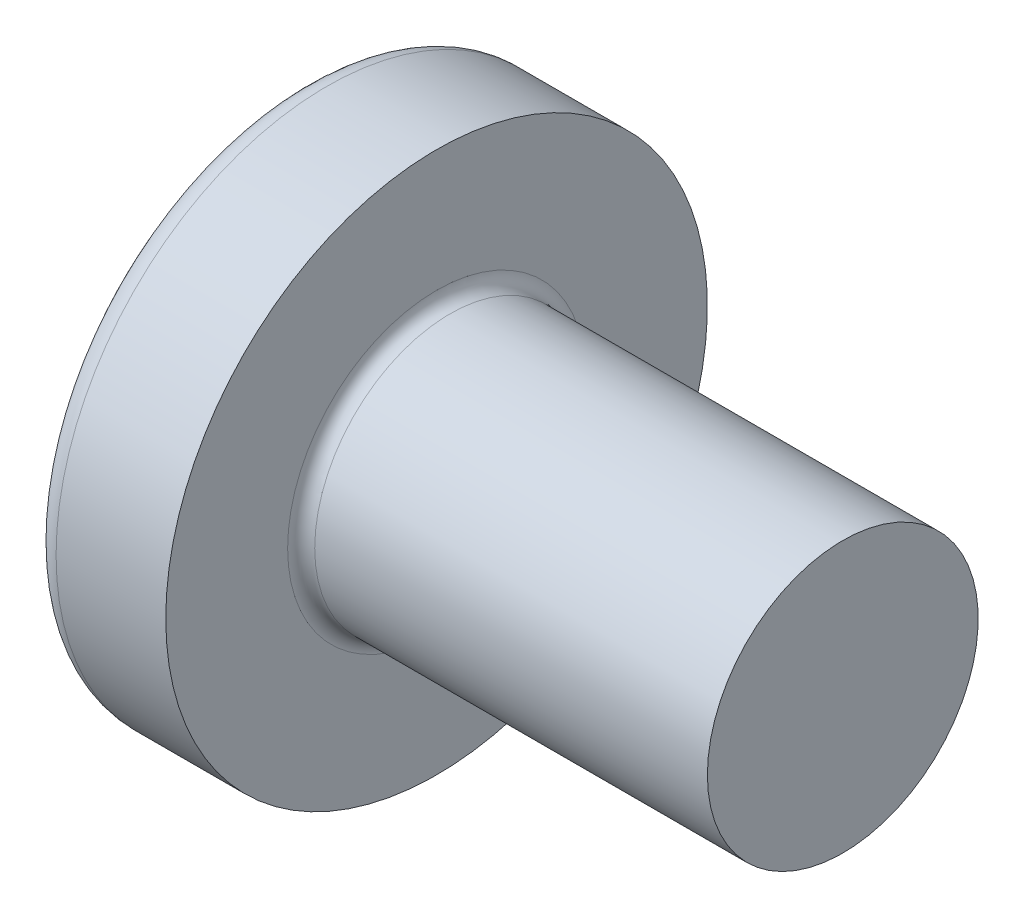
ISO-10303-21;
HEADER;
FILE_DESCRIPTION(('STEP AP214'),'2;1');
FILE_NAME('part.step','',(''),(''),'','','');
FILE_SCHEMA(('AUTOMOTIVE_DESIGN { 1 0 10303 214 1 1 1 1 }'));
ENDSEC;
DATA;
#1=APPLICATION_CONTEXT('core data for automotive mechanical design processes');
#2=APPLICATION_PROTOCOL_DEFINITION('international standard','automotive_design',2000,#1);
#3=PRODUCT_CONTEXT('',#1,'mechanical');
#4=PRODUCT('Part','Part','',(#3));
#5=PRODUCT_RELATED_PRODUCT_CATEGORY('part','',(#4));
#6=PRODUCT_DEFINITION_FORMATION('','',#4);
#7=PRODUCT_DEFINITION_CONTEXT('part definition',#1,'design');
#8=PRODUCT_DEFINITION('design','',#6,#7);
#9=PRODUCT_DEFINITION_SHAPE('','',#8);
#10=(LENGTH_UNIT() NAMED_UNIT(*) SI_UNIT(.MILLI.,.METRE.));
#11=(NAMED_UNIT(*) PLANE_ANGLE_UNIT() SI_UNIT($,.RADIAN.));
#12=(NAMED_UNIT(*) SI_UNIT($,.STERADIAN.) SOLID_ANGLE_UNIT());
#13=UNCERTAINTY_MEASURE_WITH_UNIT(LENGTH_MEASURE(1.E-05),#10,'distance_accuracy_value','');
#14=(GEOMETRIC_REPRESENTATION_CONTEXT(3) GLOBAL_UNCERTAINTY_ASSIGNED_CONTEXT((#13)) GLOBAL_UNIT_ASSIGNED_CONTEXT((#10,
#11,#12)) REPRESENTATION_CONTEXT('',''));
#15=CARTESIAN_POINT('',(0.,0.,0.));
#16=DIRECTION('',(0.,0.,1.));
#17=DIRECTION('',(1.,0.,0.));
#18=AXIS2_PLACEMENT_3D('',#15,#16,#17);
#19=CARTESIAN_POINT('',(3.2,0.,0.));
#20=DIRECTION('',(-1.,0.,0.));
#21=DIRECTION('',(0.,1.,0.));
#22=AXIS2_PLACEMENT_3D('',#19,#20,#21);
#23=SPHERICAL_SURFACE('',#22,3.2);
#24=CARTESIAN_POINT('',(0.646379599446117,0.,0.));
#25=DIRECTION('',(-1.,0.,0.));
#26=DIRECTION('',(0.,0.,1.));
#27=AXIS2_PLACEMENT_3D('',#24,#25,#26);
#28=CIRCLE('',#27,1.92847682119205);
#29=CARTESIAN_POINT('',(0.646379599446117,0.,1.92847682119205));
#30=VERTEX_POINT('',#29);
#31=EDGE_CURVE('E236',#30,#30,#28,.T.);
#32=ORIENTED_EDGE('',*,*,#31,.T.);
#33=EDGE_LOOP('',(#32));
#34=FACE_BOUND('',#33,.T.);
#35=CARTESIAN_POINT('',(0.0321614467928854,0.,0.));
#36=DIRECTION('',(1.,0.,0.));
#37=DIRECTION('',(0.,0.,-1.));
#38=AXIS2_PLACEMENT_3D('',#35,#36,#37);
#39=CIRCLE('',#38,0.452547125518057);
#40=CARTESIAN_POINT('',(0.0321614467928853,-0.239999999999998,-0.38366508938742));
#41=VERTEX_POINT('',#40);
#42=CARTESIAN_POINT('',(0.0321614467928852,-0.383665089387424,-0.24));
#43=VERTEX_POINT('',#42);
#44=EDGE_CURVE('E372',#41,#43,#39,.F.);
#45=ORIENTED_EDGE('',*,*,#44,.F.);
#46=CARTESIAN_POINT('',(3.2,-0.24,0.));
#47=DIRECTION('',(0.,1.,0.));
#48=DIRECTION('',(0.,0.,1.));
#49=AXIS2_PLACEMENT_3D('',#46,#47,#48);
#50=CIRCLE('',#49,3.19098730802866);
#51=CARTESIAN_POINT('',(0.160076673366102,-0.239999999999996,-0.970188728128246));
#52=VERTEX_POINT('',#51);
#53=EDGE_CURVE('E298',#52,#41,#50,.T.);
#54=ORIENTED_EDGE('',*,*,#53,.F.);
#55=CARTESIAN_POINT('',(2.98218780828175,0.,0.436863744320002));
#56=DIRECTION('',(0.446197753347436,0.,-0.894934391398443));
#57=DIRECTION('',(-0.894934391398442,0.,-0.446197753347436));
#58=AXIS2_PLACEMENT_3D('',#55,#56,#57);
#59=CIRCLE('',#58,3.16254769419176);
#60=CARTESIAN_POINT('',(0.160076673366103,0.240000000000003,-0.970188728128243));
#61=VERTEX_POINT('',#60);
#62=EDGE_CURVE('E270',#52,#61,#59,.T.);
#63=ORIENTED_EDGE('',*,*,#62,.T.);
#64=CARTESIAN_POINT('',(3.2,0.24,0.));
#65=DIRECTION('',(0.,-1.,0.));
#66=DIRECTION('',(0.,0.,-1.));
#67=AXIS2_PLACEMENT_3D('',#64,#65,#66);
#68=CIRCLE('',#67,3.19098730802866);
#69=CARTESIAN_POINT('',(0.0321614467928856,0.240000000000001,-0.383665089387418));
#70=VERTEX_POINT('',#69);
#71=EDGE_CURVE('E325',#70,#61,#68,.T.);
#72=ORIENTED_EDGE('',*,*,#71,.F.);
#73=CARTESIAN_POINT('',(0.0321614467928852,0.383665089387413,-0.24));
#74=VERTEX_POINT('',#73);
#75=EDGE_CURVE('E391',#74,#70,#39,.F.);
#76=ORIENTED_EDGE('',*,*,#75,.F.);
#77=CARTESIAN_POINT('',(3.2,0.,-0.24));
#78=DIRECTION('',(0.,0.,1.));
#79=DIRECTION('',(1.,0.,0.));
#80=AXIS2_PLACEMENT_3D('',#77,#78,#79);
#81=CIRCLE('',#80,3.19098730802866);
#82=CARTESIAN_POINT('',(0.160076673366104,0.970188728128243,-0.24));
#83=VERTEX_POINT('',#82);
#84=EDGE_CURVE('E264',#83,#74,#81,.T.);
#85=ORIENTED_EDGE('',*,*,#84,.F.);
#86=CARTESIAN_POINT('',(2.98218780828175,-0.436863744320003,0.));
#87=DIRECTION('',(0.446197753347436,0.894934391398443,0.));
#88=DIRECTION('',(-0.894934391398442,0.446197753347436,0.));
#89=AXIS2_PLACEMENT_3D('',#86,#87,#88);
#90=CIRCLE('',#89,3.16254769419176);
#91=CARTESIAN_POINT('',(0.160076673366105,0.970188728128243,0.24));
#92=VERTEX_POINT('',#91);
#93=EDGE_CURVE('E267',#83,#92,#90,.T.);
#94=ORIENTED_EDGE('',*,*,#93,.T.);
#95=CARTESIAN_POINT('',(3.2,0.,0.24));
#96=DIRECTION('',(0.,0.,-1.));
#97=DIRECTION('',(-1.,0.,0.));
#98=AXIS2_PLACEMENT_3D('',#95,#96,#97);
#99=CIRCLE('',#98,3.19098730802866);
#100=CARTESIAN_POINT('',(0.0321614467928854,0.383665089387413,0.239999999999999));
#101=VERTEX_POINT('',#100);
#102=EDGE_CURVE('E260',#101,#92,#99,.T.);
#103=ORIENTED_EDGE('',*,*,#102,.F.);
#104=CARTESIAN_POINT('',(0.0321614467928855,0.239999999999999,0.38366508938742));
#105=VERTEX_POINT('',#104);
#106=EDGE_CURVE('E390',#105,#101,#39,.F.);
#107=ORIENTED_EDGE('',*,*,#106,.F.);
#108=CARTESIAN_POINT('',(0.160076673366103,0.239999999999997,0.970188728128244));
#109=VERTEX_POINT('',#108);
#110=EDGE_CURVE('E280',#109,#105,#68,.T.);
#111=ORIENTED_EDGE('',*,*,#110,.F.);
#112=CARTESIAN_POINT('',(2.98218780828175,0.,-0.436863744320002));
#113=DIRECTION('',(0.446197753347436,0.,0.894934391398443));
#114=DIRECTION('',(0.894934391398442,0.,-0.446197753347436));
#115=AXIS2_PLACEMENT_3D('',#112,#113,#114);
#116=CIRCLE('',#115,3.16254769419176);
#117=CARTESIAN_POINT('',(0.160076673366103,-0.240000000000003,0.970188728128243));
#118=VERTEX_POINT('',#117);
#119=EDGE_CURVE('E47',#109,#118,#116,.T.);
#120=ORIENTED_EDGE('',*,*,#119,.T.);
#121=CARTESIAN_POINT('',(0.0321614467928852,-0.240000000000001,0.383665089387419));
#122=VERTEX_POINT('',#121);
#123=EDGE_CURVE('E277',#122,#118,#50,.T.);
#124=ORIENTED_EDGE('',*,*,#123,.F.);
#125=CARTESIAN_POINT('',(0.0321614467928854,-0.383665089387423,0.239999999999999));
#126=VERTEX_POINT('',#125);
#127=EDGE_CURVE('E426',#126,#122,#39,.F.);
#128=ORIENTED_EDGE('',*,*,#127,.F.);
#129=CARTESIAN_POINT('',(0.160076673366101,-0.970188728128245,0.239999999999999));
#130=VERTEX_POINT('',#129);
#131=EDGE_CURVE('E261',#130,#126,#99,.T.);
#132=ORIENTED_EDGE('',*,*,#131,.F.);
#133=CARTESIAN_POINT('',(2.98218780828175,0.436863744320001,0.));
#134=DIRECTION('',(0.446197753347436,-0.894934391398443,0.));
#135=DIRECTION('',(0.894934391398442,0.446197753347436,0.));
#136=AXIS2_PLACEMENT_3D('',#133,#134,#135);
#137=CIRCLE('',#136,3.16254769419176);
#138=CARTESIAN_POINT('',(0.160076673366101,-0.970188728128245,-0.24));
#139=VERTEX_POINT('',#138);
#140=EDGE_CURVE('E257',#130,#139,#137,.T.);
#141=ORIENTED_EDGE('',*,*,#140,.T.);
#142=EDGE_CURVE('E62',#43,#139,#81,.T.);
#143=ORIENTED_EDGE('',*,*,#142,.F.);
#144=EDGE_LOOP('',(#45,#54,#63,#72,#76,#85,#94,#103,#107,#111,#120,#124,#128,#132,#141,#143));
#145=FACE_BOUND('',#144,.T.);
#146=ADVANCED_FACE('F34',(#34,#145),#23,.T.);
#147=CARTESIAN_POINT('',(1.42,0.342014234961647,-0.24));
#148=DIRECTION('',(0.,0.,1.));
#149=DIRECTION('',(1.,0.,0.));
#150=AXIS2_PLACEMENT_3D('',#147,#148,#149);
#151=PLANE('',#150);
#152=ORIENTED_EDGE('',*,*,#84,.T.);
#153=CARTESIAN_POINT('',(-0.626811087646333,0.437068483432734,-0.24));
#154=CARTESIAN_POINT('',(-0.489788496188268,0.426133650699674,-0.24));
#155=CARTESIAN_POINT('',(-0.35277275089666,0.415111501640762,-0.24));
#156=CARTESIAN_POINT('',(-0.0787578829644778,0.392826208775377,-0.24));
#157=CARTESIAN_POINT('',(0.0582412392502161,0.381563059737591,-0.24));
#158=CARTESIAN_POINT('',(0.332213907654152,0.358729879929546,-0.24));
#159=CARTESIAN_POINT('',(0.469187453856035,0.347159849311357,-0.24));
#160=CARTESIAN_POINT('',(0.743097225439297,0.323608060039765,-0.24));
#161=CARTESIAN_POINT('',(0.880033451350377,0.311626307573655,-0.24));
#162=CARTESIAN_POINT('',(1.12503843743479,0.289667437089413,-0.24));
#163=CARTESIAN_POINT('',(1.23311691792,0.279799173776849,-0.24));
#164=CARTESIAN_POINT('',(1.4492267018282,0.259570129968442,-0.24));
#165=CARTESIAN_POINT('',(1.55725800577256,0.249209355061897,-0.24));
#166=CARTESIAN_POINT('',(1.77325939831777,0.227783788850472,-0.24));
#167=CARTESIAN_POINT('',(1.88122948205844,0.216718947894398,-0.24));
#168=CARTESIAN_POINT('',(2.04309848476113,0.199296215271932,-0.24));
#169=CARTESIAN_POINT('',(2.09704158415864,0.193350927204474,-0.24));
#170=CARTESIAN_POINT('',(2.20488609252136,0.181086542764125,-0.24));
#171=CARTESIAN_POINT('',(2.25878750075649,0.174767439988846,-0.24));
#172=CARTESIAN_POINT('',(2.31266102213859,0.168212174791089,-0.24));
#173=B_SPLINE_CURVE_WITH_KNOTS('',3,(#153,#154,#155,#156,#157,#158,#159,#160,#161,#162,#163,
#164,#165,#166,#167,#168,#169,#170,#171,#172),.UNSPECIFIED.,.F.,.F.,(4,2,2,2,2,2,2,2,2,4),(0.,
0.412374804430943,0.824758569256476,1.23714212973639,1.64951949568622,1.97510284899868,
2.30068250829037,2.62628515317116,2.78909323564388,2.95190410736571),.UNSPECIFIED.);
#174=CARTESIAN_POINT('',(1.42,0.262259890185289,-0.240000000000001));
#175=VERTEX_POINT('',#174);
#176=EDGE_CURVE('E412',#74,#175,#173,.T.);
#177=ORIENTED_EDGE('',*,*,#176,.T.);
#178=DIRECTION('',(0.,1.,0.));
#179=VECTOR('',#178,1.);
#180=CARTESIAN_POINT('',(1.42,-0.342014234961648,-0.24));
#181=LINE('',#180,#179);
#182=CARTESIAN_POINT('',(1.42,0.342014234961647,-0.24));
#183=VERTEX_POINT('',#182);
#184=EDGE_CURVE('E354',#175,#183,#181,.T.);
#185=ORIENTED_EDGE('',*,*,#184,.T.);
#186=DIRECTION('',(0.894934391398442,-0.446197753347436,0.));
#187=VECTOR('',#186,1.);
#188=CARTESIAN_POINT('',(0.,1.05,-0.24));
#189=LINE('',#188,#187);
#190=EDGE_CURVE('E237',#83,#183,#189,.T.);
#191=ORIENTED_EDGE('',*,*,#190,.F.);
#192=EDGE_LOOP('',(#152,#177,#185,#191));
#193=FACE_BOUND('',#192,.T.);
#194=ADVANCED_FACE('F192',(#193),#151,.T.);
#195=CARTESIAN_POINT('',(1.42,-0.342014234961648,-0.24));
#196=VERTEX_POINT('',#195);
#197=CARTESIAN_POINT('',(1.42,-0.262259890185289,-0.240000000000001));
#198=VERTEX_POINT('',#197);
#199=EDGE_CURVE('E245',#196,#198,#181,.T.);
#200=ORIENTED_EDGE('',*,*,#199,.T.);
#201=CARTESIAN_POINT('',(-0.626811087646334,-0.437068483432734,-0.24));
#202=CARTESIAN_POINT('',(-0.489788496188269,-0.426133650699674,-0.24));
#203=CARTESIAN_POINT('',(-0.352772750896661,-0.415111501640762,-0.24));
#204=CARTESIAN_POINT('',(-0.0787578829644786,-0.392826208775377,-0.24));
#205=CARTESIAN_POINT('',(0.0582412392502154,-0.381563059737591,-0.24));
#206=CARTESIAN_POINT('',(0.332213907654152,-0.358729879929546,-0.24));
#207=CARTESIAN_POINT('',(0.469187453856034,-0.347159849311357,-0.24));
#208=CARTESIAN_POINT('',(0.743097225439296,-0.323608060039765,-0.24));
#209=CARTESIAN_POINT('',(0.880033451350376,-0.311626307573655,-0.24));
#210=CARTESIAN_POINT('',(1.12503843743479,-0.289667437089413,-0.24));
#211=CARTESIAN_POINT('',(1.23311691792,-0.279799173776849,-0.24));
#212=CARTESIAN_POINT('',(1.4492267018282,-0.259570129968442,-0.24));
#213=CARTESIAN_POINT('',(1.55725800577256,-0.249209355061897,-0.24));
#214=CARTESIAN_POINT('',(1.77325939831777,-0.227783788850472,-0.24));
#215=CARTESIAN_POINT('',(1.88122948205844,-0.216718947894398,-0.24));
#216=CARTESIAN_POINT('',(2.04309848476113,-0.199296215271932,-0.24));
#217=CARTESIAN_POINT('',(2.09704158415864,-0.193350927204474,-0.24));
#218=CARTESIAN_POINT('',(2.20488609252136,-0.181086542764125,-0.24));
#219=CARTESIAN_POINT('',(2.25878750075649,-0.174767439988846,-0.24));
#220=CARTESIAN_POINT('',(2.31266102213859,-0.168212174791088,-0.24));
#221=B_SPLINE_CURVE_WITH_KNOTS('',3,(#201,#202,#203,#204,#205,#206,#207,#208,#209,#210,#211,
#212,#213,#214,#215,#216,#217,#218,#219,#220),.UNSPECIFIED.,.F.,.F.,(4,2,2,2,2,2,2,2,2,4),(0.,
0.412374804430943,0.824758569256476,1.23714212973639,1.64951949568622,1.97510284899868,
2.30068250829037,2.62628515317116,2.78909323564388,2.95190410736571),.UNSPECIFIED.);
#222=EDGE_CURVE('E389',#198,#43,#221,.F.);
#223=ORIENTED_EDGE('',*,*,#222,.T.);
#224=ORIENTED_EDGE('',*,*,#142,.T.);
#225=DIRECTION('',(0.894934391398442,0.446197753347436,0.));
#226=VECTOR('',#225,1.);
#227=CARTESIAN_POINT('',(0.,-1.05,-0.24));
#228=LINE('',#227,#226);
#229=EDGE_CURVE('E328',#139,#196,#228,.T.);
#230=ORIENTED_EDGE('',*,*,#229,.T.);
#231=EDGE_LOOP('',(#200,#223,#224,#230));
#232=FACE_BOUND('',#231,.T.);
#233=ADVANCED_FACE('F198',(#232),#151,.T.);
#234=CARTESIAN_POINT('',(1.42,-0.342014234961647,0.24));
#235=DIRECTION('',(0.,0.,-1.));
#236=DIRECTION('',(-1.,0.,0.));
#237=AXIS2_PLACEMENT_3D('',#234,#235,#236);
#238=PLANE('',#237);
#239=DIRECTION('',(0.,-1.,0.));
#240=VECTOR('',#239,1.);
#241=CARTESIAN_POINT('',(1.42,0.342014234961647,0.24));
#242=LINE('',#241,#240);
#243=CARTESIAN_POINT('',(1.42,0.342014234961647,0.24));
#244=VERTEX_POINT('',#243);
#245=CARTESIAN_POINT('',(1.42,0.262259890185289,0.240000000000001));
#246=VERTEX_POINT('',#245);
#247=EDGE_CURVE('E337',#244,#246,#242,.T.);
#248=ORIENTED_EDGE('',*,*,#247,.T.);
#249=CARTESIAN_POINT('',(-0.626811087646333,0.437068483432734,0.239999999999999));
#250=CARTESIAN_POINT('',(-0.489788496188267,0.426133650699674,0.239999999999999));
#251=CARTESIAN_POINT('',(-0.35277275089666,0.415111501640762,0.239999999999999));
#252=CARTESIAN_POINT('',(-0.0787578829644775,0.392826208775377,0.239999999999999));
#253=CARTESIAN_POINT('',(0.0582412392502165,0.381563059737591,0.239999999999999));
#254=CARTESIAN_POINT('',(0.332213907654153,0.358729879929546,0.239999999999999));
#255=CARTESIAN_POINT('',(0.469187453856035,0.347159849311358,0.239999999999999));
#256=CARTESIAN_POINT('',(0.743097225439297,0.323608060039765,0.24));
#257=CARTESIAN_POINT('',(0.880033451350377,0.311626307573655,0.24));
#258=CARTESIAN_POINT('',(1.12503843743479,0.289667437089413,0.24));
#259=CARTESIAN_POINT('',(1.23311691792,0.279799173776849,0.24));
#260=CARTESIAN_POINT('',(1.4492267018282,0.259570129968442,0.24));
#261=CARTESIAN_POINT('',(1.55725800577256,0.249209355061897,0.24));
#262=CARTESIAN_POINT('',(1.77325939831777,0.227783788850472,0.24));
#263=CARTESIAN_POINT('',(1.88122948205844,0.216718947894399,0.24));
#264=CARTESIAN_POINT('',(2.04309848476113,0.199296215271932,0.24));
#265=CARTESIAN_POINT('',(2.09704158415864,0.193350927204474,0.24));
#266=CARTESIAN_POINT('',(2.20488609252136,0.181086542764125,0.24));
#267=CARTESIAN_POINT('',(2.25878750075649,0.174767439988846,0.24));
#268=CARTESIAN_POINT('',(2.31266102213859,0.168212174791088,0.24));
#269=B_SPLINE_CURVE_WITH_KNOTS('',3,(#249,#250,#251,#252,#253,#254,#255,#256,#257,#258,#259,
#260,#261,#262,#263,#264,#265,#266,#267,#268),.UNSPECIFIED.,.F.,.F.,(4,2,2,2,2,2,2,2,2,4),(0.,
0.412374804430943,0.824758569256476,1.23714212973639,1.64951949568622,1.97510284899868,
2.30068250829037,2.62628515317116,2.78909323564388,2.95190410736571),.UNSPECIFIED.);
#270=EDGE_CURVE('E664',#246,#101,#269,.F.);
#271=ORIENTED_EDGE('',*,*,#270,.T.);
#272=ORIENTED_EDGE('',*,*,#102,.T.);
#273=DIRECTION('',(0.894934391398442,-0.446197753347436,0.));
#274=VECTOR('',#273,1.);
#275=CARTESIAN_POINT('',(0.,1.05,0.24));
#276=LINE('',#275,#274);
#277=EDGE_CURVE('E242',#92,#244,#276,.T.);
#278=ORIENTED_EDGE('',*,*,#277,.T.);
#279=EDGE_LOOP('',(#248,#271,#272,#278));
#280=FACE_BOUND('',#279,.T.);
#281=ADVANCED_FACE('F408',(#280),#238,.T.);
#282=ORIENTED_EDGE('',*,*,#131,.T.);
#283=CARTESIAN_POINT('',(-0.626811087646334,-0.437068483432734,0.239999999999999));
#284=CARTESIAN_POINT('',(-0.489788496188268,-0.426133650699674,0.239999999999999));
#285=CARTESIAN_POINT('',(-0.35277275089666,-0.415111501640762,0.239999999999999));
#286=CARTESIAN_POINT('',(-0.0787578829644783,-0.392826208775377,0.239999999999999));
#287=CARTESIAN_POINT('',(0.0582412392502158,-0.381563059737591,0.239999999999999));
#288=CARTESIAN_POINT('',(0.332213907654152,-0.358729879929547,0.239999999999999));
#289=CARTESIAN_POINT('',(0.469187453856034,-0.347159849311358,0.239999999999999));
#290=CARTESIAN_POINT('',(0.743097225439297,-0.323608060039765,0.24));
#291=CARTESIAN_POINT('',(0.880033451350377,-0.311626307573655,0.24));
#292=CARTESIAN_POINT('',(1.12503843743479,-0.289667437089414,0.24));
#293=CARTESIAN_POINT('',(1.23311691791999,-0.279799173776849,0.24));
#294=CARTESIAN_POINT('',(1.4492267018282,-0.259570129968442,0.24));
#295=CARTESIAN_POINT('',(1.55725800577256,-0.249209355061897,0.24));
#296=CARTESIAN_POINT('',(1.77325939831777,-0.227783788850472,0.24));
#297=CARTESIAN_POINT('',(1.88122948205844,-0.216718947894399,0.24));
#298=CARTESIAN_POINT('',(2.04309848476113,-0.199296215271932,0.24));
#299=CARTESIAN_POINT('',(2.09704158415864,-0.193350927204474,0.24));
#300=CARTESIAN_POINT('',(2.20488609252136,-0.181086542764125,0.24));
#301=CARTESIAN_POINT('',(2.25878750075649,-0.174767439988846,0.24));
#302=CARTESIAN_POINT('',(2.31266102213859,-0.168212174791088,0.24));
#303=B_SPLINE_CURVE_WITH_KNOTS('',3,(#283,#284,#285,#286,#287,#288,#289,#290,#291,#292,#293,
#294,#295,#296,#297,#298,#299,#300,#301,#302),.UNSPECIFIED.,.F.,.F.,(4,2,2,2,2,2,2,2,2,4),(0.,
0.412374804430943,0.824758569256476,1.23714212973639,1.64951949568622,1.97510284899868,
2.30068250829037,2.62628515317116,2.78909323564388,2.95190410736571),.UNSPECIFIED.);
#304=CARTESIAN_POINT('',(1.42,-0.262259890185289,0.240000000000001));
#305=VERTEX_POINT('',#304);
#306=EDGE_CURVE('E427',#126,#305,#303,.T.);
#307=ORIENTED_EDGE('',*,*,#306,.T.);
#308=CARTESIAN_POINT('',(1.42,-0.342014234961648,0.24));
#309=VERTEX_POINT('',#308);
#310=EDGE_CURVE('E339',#305,#309,#242,.T.);
#311=ORIENTED_EDGE('',*,*,#310,.T.);
#312=DIRECTION('',(0.894934391398442,0.446197753347436,0.));
#313=VECTOR('',#312,1.);
#314=CARTESIAN_POINT('',(0.,-1.05,0.239999999999999));
#315=LINE('',#314,#313);
#316=EDGE_CURVE('E330',#130,#309,#315,.T.);
#317=ORIENTED_EDGE('',*,*,#316,.F.);
#318=EDGE_LOOP('',(#282,#307,#311,#317));
#319=FACE_BOUND('',#318,.T.);
#320=ADVANCED_FACE('F512',(#319),#238,.T.);
#321=CARTESIAN_POINT('',(1.42,0.342014234961647,0.24));
#322=DIRECTION('',(0.446197753347436,0.894934391398443,0.));
#323=DIRECTION('',(-0.894934391398442,0.446197753347436,0.));
#324=AXIS2_PLACEMENT_3D('',#321,#322,#323);
#325=PLANE('',#324);
#326=CARTESIAN_POINT('',(2.01772965253961,0.0439972734550524,0.));
#327=DIRECTION('',(0.446197753347436,0.894934391398443,0.));
#328=DIRECTION('',(-0.894934391398443,0.446197753347436,0.));
#329=AXIS2_PLACEMENT_3D('',#326,#327,#328);
#330=ELLIPSE('',#329,0.703057486597294,0.310602005333466);
#331=CARTESIAN_POINT('',(1.42,0.342014234961648,0.0969871799961127));
#332=VERTEX_POINT('',#331);
#333=CARTESIAN_POINT('',(1.42,0.342014234961648,-0.096987179996113));
#334=VERTEX_POINT('',#333);
#335=EDGE_CURVE('E303',#332,#334,#330,.F.);
#336=ORIENTED_EDGE('',*,*,#335,.F.);
#337=DIRECTION('',(0.,0.,-1.));
#338=VECTOR('',#337,1.);
#339=CARTESIAN_POINT('',(1.42,0.342014234961647,0.24));
#340=LINE('',#339,#338);
#341=EDGE_CURVE('E340',#244,#332,#340,.T.);
#342=ORIENTED_EDGE('',*,*,#341,.F.);
#343=ORIENTED_EDGE('',*,*,#277,.F.);
#344=ORIENTED_EDGE('',*,*,#93,.F.);
#345=ORIENTED_EDGE('',*,*,#190,.T.);
#346=EDGE_CURVE('E342',#334,#183,#340,.T.);
#347=ORIENTED_EDGE('',*,*,#346,.F.);
#348=EDGE_LOOP('',(#336,#342,#343,#344,#345,#347));
#349=FACE_BOUND('',#348,.T.);
#350=ADVANCED_FACE('F406',(#349),#325,.F.);
#351=CARTESIAN_POINT('',(1.42,-0.342014234961648,-0.24));
#352=DIRECTION('',(0.446197753347436,-0.894934391398443,0.));
#353=DIRECTION('',(0.894934391398442,0.446197753347436,0.));
#354=AXIS2_PLACEMENT_3D('',#351,#352,#353);
#355=PLANE('',#354);
#356=CARTESIAN_POINT('',(2.01772965253961,-0.0439972734550524,0.));
#357=DIRECTION('',(0.446197753347436,-0.894934391398443,0.));
#358=DIRECTION('',(-0.894934391398443,-0.446197753347436,0.));
#359=AXIS2_PLACEMENT_3D('',#356,#357,#358);
#360=ELLIPSE('',#359,0.703057486597294,0.310602005333466);
#361=CARTESIAN_POINT('',(1.42,-0.342014234961649,-0.0969871799961107));
#362=VERTEX_POINT('',#361);
#363=CARTESIAN_POINT('',(1.42,-0.342014234961649,0.0969871799961103));
#364=VERTEX_POINT('',#363);
#365=EDGE_CURVE('E666',#362,#364,#360,.F.);
#366=ORIENTED_EDGE('',*,*,#365,.F.);
#367=DIRECTION('',(0.,0.,1.));
#368=VECTOR('',#367,1.);
#369=CARTESIAN_POINT('',(1.42,-0.342014234961648,-0.24));
#370=LINE('',#369,#368);
#371=EDGE_CURVE('E333',#196,#362,#370,.T.);
#372=ORIENTED_EDGE('',*,*,#371,.F.);
#373=ORIENTED_EDGE('',*,*,#229,.F.);
#374=ORIENTED_EDGE('',*,*,#140,.F.);
#375=ORIENTED_EDGE('',*,*,#316,.T.);
#376=EDGE_CURVE('E336',#364,#309,#370,.T.);
#377=ORIENTED_EDGE('',*,*,#376,.F.);
#378=EDGE_LOOP('',(#366,#372,#373,#374,#375,#377));
#379=FACE_BOUND('',#378,.T.);
#380=ADVANCED_FACE('F499',(#379),#355,.F.);
#381=CARTESIAN_POINT('',(1.42,0.342014234961647,-0.24));
#382=DIRECTION('',(-1.,0.,0.));
#383=DIRECTION('',(0.,0.,1.));
#384=AXIS2_PLACEMENT_3D('',#381,#382,#383);
#385=PLANE('',#384);
#386=DIRECTION('',(0.,1.,0.));
#387=VECTOR('',#386,1.);
#388=CARTESIAN_POINT('',(1.42,-0.240000000000001,0.342014234961646));
#389=LINE('',#388,#387);
#390=CARTESIAN_POINT('',(1.42,-0.240000000000001,0.342014234961646));
#391=VERTEX_POINT('',#390);
#392=CARTESIAN_POINT('',(1.42,-0.0969871799961171,0.342014234961647));
#393=VERTEX_POINT('',#392);
#394=EDGE_CURVE('E318',#391,#393,#389,.T.);
#395=ORIENTED_EDGE('',*,*,#394,.T.);
#396=CARTESIAN_POINT('',(1.42,0.,0.));
#397=DIRECTION('',(-1.,0.,0.));
#398=DIRECTION('',(0.,0.,1.));
#399=AXIS2_PLACEMENT_3D('',#396,#397,#398);
#400=CIRCLE('',#399,0.3555);
#401=CARTESIAN_POINT('',(1.42,-0.240000000000001,0.262259890185289));
#402=VERTEX_POINT('',#401);
#403=EDGE_CURVE('E692',#402,#393,#400,.T.);
#404=ORIENTED_EDGE('',*,*,#403,.F.);
#405=DIRECTION('',(0.,0.,-1.));
#406=VECTOR('',#405,1.);
#407=CARTESIAN_POINT('',(1.42,-0.240000000000001,0.342014234961646));
#408=LINE('',#407,#406);
#409=EDGE_CURVE('E314',#391,#402,#408,.T.);
#410=ORIENTED_EDGE('',*,*,#409,.F.);
#411=EDGE_LOOP('',(#395,#404,#410));
#412=FACE_BOUND('',#411,.T.);
#413=ADVANCED_FACE('F492',(#412),#385,.T.);
#414=ORIENTED_EDGE('',*,*,#310,.F.);
#415=EDGE_CURVE('E697',#364,#305,#400,.T.);
#416=ORIENTED_EDGE('',*,*,#415,.F.);
#417=ORIENTED_EDGE('',*,*,#376,.T.);
#418=EDGE_LOOP('',(#414,#416,#417));
#419=FACE_BOUND('',#418,.T.);
#420=ADVANCED_FACE('F485',(#419),#385,.T.);
#421=ORIENTED_EDGE('',*,*,#371,.T.);
#422=EDGE_CURVE('E383',#198,#362,#400,.T.);
#423=ORIENTED_EDGE('',*,*,#422,.F.);
#424=ORIENTED_EDGE('',*,*,#199,.F.);
#425=EDGE_LOOP('',(#421,#423,#424));
#426=FACE_BOUND('',#425,.T.);
#427=ADVANCED_FACE('F479',(#426),#385,.T.);
#428=CARTESIAN_POINT('',(1.42,-0.239999999999999,-0.262259890185288));
#429=VERTEX_POINT('',#428);
#430=CARTESIAN_POINT('',(1.42,-0.239999999999999,-0.342014234961649));
#431=VERTEX_POINT('',#430);
#432=EDGE_CURVE('E317',#429,#431,#408,.T.);
#433=ORIENTED_EDGE('',*,*,#432,.F.);
#434=CARTESIAN_POINT('',(1.42,-0.0969871799961125,-0.342014234961648));
#435=VERTEX_POINT('',#434);
#436=EDGE_CURVE('E54',#435,#429,#400,.T.);
#437=ORIENTED_EDGE('',*,*,#436,.F.);
#438=DIRECTION('',(0.,-1.,0.));
#439=VECTOR('',#438,1.);
#440=CARTESIAN_POINT('',(1.42,0.240000000000001,-0.342014234961647));
#441=LINE('',#440,#439);
#442=EDGE_CURVE('E313',#435,#431,#441,.T.);
#443=ORIENTED_EDGE('',*,*,#442,.T.);
#444=EDGE_LOOP('',(#433,#437,#443));
#445=FACE_BOUND('',#444,.T.);
#446=ADVANCED_FACE('F378',(#445),#385,.T.);
#447=CARTESIAN_POINT('',(1.42,0.240000000000001,-0.342014234961647));
#448=VERTEX_POINT('',#447);
#449=CARTESIAN_POINT('',(1.42,0.0969871799961153,-0.342014234961648));
#450=VERTEX_POINT('',#449);
#451=EDGE_CURVE('E310',#448,#450,#441,.T.);
#452=ORIENTED_EDGE('',*,*,#451,.T.);
#453=CARTESIAN_POINT('',(1.42,0.240000000000001,-0.262259890185288));
#454=VERTEX_POINT('',#453);
#455=EDGE_CURVE('E382',#454,#450,#400,.T.);
#456=ORIENTED_EDGE('',*,*,#455,.F.);
#457=DIRECTION('',(0.,0.,1.));
#458=VECTOR('',#457,1.);
#459=CARTESIAN_POINT('',(1.42,0.240000000000001,-0.342014234961647));
#460=LINE('',#459,#458);
#461=EDGE_CURVE('E322',#448,#454,#460,.T.);
#462=ORIENTED_EDGE('',*,*,#461,.F.);
#463=EDGE_LOOP('',(#452,#456,#462));
#464=FACE_BOUND('',#463,.T.);
#465=ADVANCED_FACE('F467',(#464),#385,.T.);
#466=ORIENTED_EDGE('',*,*,#184,.F.);
#467=EDGE_CURVE('E681',#334,#175,#400,.T.);
#468=ORIENTED_EDGE('',*,*,#467,.F.);
#469=ORIENTED_EDGE('',*,*,#346,.T.);
#470=EDGE_LOOP('',(#466,#468,#469));
#471=FACE_BOUND('',#470,.T.);
#472=ADVANCED_FACE('F460',(#471),#385,.T.);
#473=ORIENTED_EDGE('',*,*,#341,.T.);
#474=EDGE_CURVE('E683',#246,#332,#400,.T.);
#475=ORIENTED_EDGE('',*,*,#474,.F.);
#476=ORIENTED_EDGE('',*,*,#247,.F.);
#477=EDGE_LOOP('',(#473,#475,#476));
#478=FACE_BOUND('',#477,.T.);
#479=ADVANCED_FACE('F454',(#478),#385,.T.);
#480=CARTESIAN_POINT('',(1.42,0.239999999999999,0.342014234961648));
#481=DIRECTION('',(0.,-1.,0.));
#482=DIRECTION('',(1.,0.,0.));
#483=AXIS2_PLACEMENT_3D('',#480,#481,#482);
#484=PLANE('',#483);
#485=ORIENTED_EDGE('',*,*,#110,.T.);
#486=CARTESIAN_POINT('',(-0.626811087646333,0.239999999999998,0.437068483432735));
#487=CARTESIAN_POINT('',(-0.489788496188267,0.239999999999999,0.426133650699675));
#488=CARTESIAN_POINT('',(-0.35277275089666,0.239999999999999,0.415111501640762));
#489=CARTESIAN_POINT('',(-0.0787578829644776,0.239999999999999,0.392826208775378));
#490=CARTESIAN_POINT('',(0.0582412392502165,0.239999999999999,0.381563059737592));
#491=CARTESIAN_POINT('',(0.332213907654153,0.239999999999999,0.358729879929547));
#492=CARTESIAN_POINT('',(0.469187453856035,0.239999999999999,0.347159849311358));
#493=CARTESIAN_POINT('',(0.743097225439297,0.239999999999999,0.323608060039766));
#494=CARTESIAN_POINT('',(0.880033451350377,0.239999999999999,0.311626307573656));
#495=CARTESIAN_POINT('',(1.12503843743479,0.239999999999999,0.289667437089414));
#496=CARTESIAN_POINT('',(1.23311691792,0.239999999999999,0.279799173776849));
#497=CARTESIAN_POINT('',(1.4492267018282,0.239999999999999,0.259570129968442));
#498=CARTESIAN_POINT('',(1.55725800577256,0.239999999999999,0.249209355061898));
#499=CARTESIAN_POINT('',(1.77325939831777,0.239999999999999,0.227783788850473));
#500=CARTESIAN_POINT('',(1.88122948205844,0.239999999999999,0.216718947894399));
#501=CARTESIAN_POINT('',(2.04309848476113,0.239999999999999,0.199296215271933));
#502=CARTESIAN_POINT('',(2.09704158415864,0.239999999999999,0.193350927204475));
#503=CARTESIAN_POINT('',(2.20488609252136,0.239999999999999,0.181086542764126));
#504=CARTESIAN_POINT('',(2.25878750075649,0.239999999999999,0.174767439988847));
#505=CARTESIAN_POINT('',(2.31266102213859,0.239999999999999,0.168212174791089));
#506=B_SPLINE_CURVE_WITH_KNOTS('',3,(#486,#487,#488,#489,#490,#491,#492,#493,#494,#495,#496,
#497,#498,#499,#500,#501,#502,#503,#504,#505),.UNSPECIFIED.,.F.,.F.,(4,2,2,2,2,2,2,2,2,4),(0.,
0.412374804430943,0.824758569256476,1.23714212973639,1.64951949568622,1.97510284899868,
2.30068250829037,2.62628515317116,2.78909323564388,2.95190410736571),.UNSPECIFIED.);
#507=CARTESIAN_POINT('',(1.42,0.239999999999999,0.26225989018529));
#508=VERTEX_POINT('',#507);
#509=EDGE_CURVE('E663',#105,#508,#506,.T.);
#510=ORIENTED_EDGE('',*,*,#509,.T.);
#511=CARTESIAN_POINT('',(1.42,0.239999999999999,0.342014234961648));
#512=VERTEX_POINT('',#511);
#513=EDGE_CURVE('E295',#508,#512,#460,.T.);
#514=ORIENTED_EDGE('',*,*,#513,.T.);
#515=DIRECTION('',(0.894934391398442,0.,-0.446197753347436));
#516=VECTOR('',#515,1.);
#517=CARTESIAN_POINT('',(0.,0.239999999999996,1.05));
#518=LINE('',#517,#516);
#519=EDGE_CURVE('E288',#109,#512,#518,.T.);
#520=ORIENTED_EDGE('',*,*,#519,.F.);
#521=EDGE_LOOP('',(#485,#510,#514,#520));
#522=FACE_BOUND('',#521,.T.);
#523=ADVANCED_FACE('F292',(#522),#484,.T.);
#524=CARTESIAN_POINT('',(1.42,-0.239999999999999,-0.342014234961648));
#525=DIRECTION('',(0.,1.,0.));
#526=DIRECTION('',(-1.,0.,0.));
#527=AXIS2_PLACEMENT_3D('',#524,#525,#526);
#528=PLANE('',#527);
#529=ORIENTED_EDGE('',*,*,#409,.T.);
#530=CARTESIAN_POINT('',(-0.626811087693631,-0.240000000000001,0.437068483436507));
#531=CARTESIAN_POINT('',(-0.489788496230297,-0.240000000000001,0.426133650703048));
#532=CARTESIAN_POINT('',(-0.352772750933422,-0.240000000000001,0.415111501643733));
#533=CARTESIAN_POINT('',(-0.0787578829907063,-0.240000000000001,0.392826208777528));
#534=CARTESIAN_POINT('',(0.0582412392292545,-0.240000000000001,0.381563059739325));
#535=CARTESIAN_POINT('',(0.332213907649303,-0.240000000000001,0.358729879929962));
#536=CARTESIAN_POINT('',(0.46918745386203,-0.240000000000001,0.347159849310858));
#537=CARTESIAN_POINT('',(0.743097225466974,-0.240000000000001,0.323608060037367));
#538=CARTESIAN_POINT('',(0.880033451388893,-0.240000000000001,0.311626307570274));
#539=CARTESIAN_POINT('',(1.12503843748414,-0.240000000000001,0.289667437084934));
#540=CARTESIAN_POINT('',(1.23311691796933,-0.240000000000001,0.279799173772306));
#541=CARTESIAN_POINT('',(1.44922670187753,-0.240000000000001,0.259570129963747));
#542=CARTESIAN_POINT('',(1.55725800582188,-0.240000000000001,0.249209355057114));
#543=CARTESIAN_POINT('',(1.77325939836707,-0.240000000000001,0.22778378884547));
#544=CARTESIAN_POINT('',(1.88122948210773,-0.240000000000001,0.216718947889266));
#545=CARTESIAN_POINT('',(2.0430984848104,-0.240000000000001,0.199296215266542));
#546=CARTESIAN_POINT('',(2.0970415842079,-0.240000000000001,0.193350927198988));
#547=CARTESIAN_POINT('',(2.20488609257059,-0.240000000000001,0.181086542758412));
#548=CARTESIAN_POINT('',(2.25878750080571,-0.240000000000001,0.174767439983004));
#549=CARTESIAN_POINT('',(2.31266102218779,-0.240000000000001,0.168212174785093));
#550=B_SPLINE_CURVE_WITH_KNOTS('',3,(#530,#531,#532,#533,#534,#535,#536,#537,#538,#539,#540,
#541,#542,#543,#544,#545,#546,#547,#548,#549),.UNSPECIFIED.,.F.,.F.,(4,2,2,2,2,2,2,2,2,4),(0.,
0.412374804446791,0.824758569288173,1.23714212980074,1.64951949578321,1.97510284909568,
2.30068250838737,2.62628515326816,2.78909323574089,2.95190410746272),.UNSPECIFIED.);
#551=EDGE_CURVE('E420',#402,#122,#550,.F.);
#552=ORIENTED_EDGE('',*,*,#551,.T.);
#553=ORIENTED_EDGE('',*,*,#123,.T.);
#554=DIRECTION('',(0.894934391398442,0.,-0.446197753347436));
#555=VECTOR('',#554,1.);
#556=CARTESIAN_POINT('',(0.,-0.240000000000003,1.05));
#557=LINE('',#556,#555);
#558=EDGE_CURVE('E290',#118,#391,#557,.T.);
#559=ORIENTED_EDGE('',*,*,#558,.T.);
#560=EDGE_LOOP('',(#529,#552,#553,#559));
#561=FACE_BOUND('',#560,.T.);
#562=ADVANCED_FACE('F227',(#561),#528,.T.);
#563=CARTESIAN_POINT('',(1.42,-0.240000000000001,0.342014234961646));
#564=DIRECTION('',(0.446197753347436,0.,0.894934391398443));
#565=DIRECTION('',(-0.894934391398442,0.,0.446197753347436));
#566=AXIS2_PLACEMENT_3D('',#563,#564,#565);
#567=PLANE('',#566);
#568=CARTESIAN_POINT('',(2.01772965253961,0.,0.0439972734550524));
#569=DIRECTION('',(0.446197753347436,0.,0.894934391398443));
#570=DIRECTION('',(-0.894934391398443,0.,0.446197753347436));
#571=AXIS2_PLACEMENT_3D('',#568,#569,#570);
#572=ELLIPSE('',#571,0.703057486597294,0.310602005333466);
#573=CARTESIAN_POINT('',(1.42,0.096987179996115,0.342014234961648));
#574=VERTEX_POINT('',#573);
#575=EDGE_CURVE('E418',#393,#574,#572,.F.);
#576=ORIENTED_EDGE('',*,*,#575,.F.);
#577=ORIENTED_EDGE('',*,*,#394,.F.);
#578=ORIENTED_EDGE('',*,*,#558,.F.);
#579=ORIENTED_EDGE('',*,*,#119,.F.);
#580=ORIENTED_EDGE('',*,*,#519,.T.);
#581=EDGE_CURVE('E321',#574,#512,#389,.T.);
#582=ORIENTED_EDGE('',*,*,#581,.F.);
#583=EDGE_LOOP('',(#576,#577,#578,#579,#580,#582));
#584=FACE_BOUND('',#583,.T.);
#585=ADVANCED_FACE('F286',(#584),#567,.F.);
#586=CARTESIAN_POINT('',(1.42,0.240000000000001,-0.342014234961647));
#587=DIRECTION('',(0.446197753347436,0.,-0.894934391398443));
#588=DIRECTION('',(0.894934391398442,0.,0.446197753347436));
#589=AXIS2_PLACEMENT_3D('',#586,#587,#588);
#590=PLANE('',#589);
#591=CARTESIAN_POINT('',(2.01772965253961,0.,-0.0439972734550523));
#592=DIRECTION('',(0.446197753347436,0.,-0.894934391398443));
#593=DIRECTION('',(-0.894934391398443,0.,-0.446197753347436));
#594=AXIS2_PLACEMENT_3D('',#591,#592,#593);
#595=ELLIPSE('',#594,0.703057486597294,0.310602005333466);
#596=EDGE_CURVE('E376',#450,#435,#595,.F.);
#597=ORIENTED_EDGE('',*,*,#596,.F.);
#598=ORIENTED_EDGE('',*,*,#451,.F.);
#599=DIRECTION('',(0.894934391398442,0.,0.446197753347436));
#600=VECTOR('',#599,1.);
#601=CARTESIAN_POINT('',(0.,0.240000000000004,-1.05));
#602=LINE('',#601,#600);
#603=EDGE_CURVE('E300',#61,#448,#602,.T.);
#604=ORIENTED_EDGE('',*,*,#603,.F.);
#605=ORIENTED_EDGE('',*,*,#62,.F.);
#606=DIRECTION('',(0.894934391398442,0.,0.446197753347436));
#607=VECTOR('',#606,1.);
#608=CARTESIAN_POINT('',(0.,-0.239999999999996,-1.05));
#609=LINE('',#608,#607);
#610=EDGE_CURVE('E307',#52,#431,#609,.T.);
#611=ORIENTED_EDGE('',*,*,#610,.T.);
#612=ORIENTED_EDGE('',*,*,#442,.F.);
#613=EDGE_LOOP('',(#597,#598,#604,#605,#611,#612));
#614=FACE_BOUND('',#613,.T.);
#615=ADVANCED_FACE('F367',(#614),#590,.F.);
#616=ORIENTED_EDGE('',*,*,#461,.T.);
#617=CARTESIAN_POINT('',(-0.62681108769363,0.240000000000001,-0.437068483436506));
#618=CARTESIAN_POINT('',(-0.489788496230297,0.240000000000001,-0.426133650703047));
#619=CARTESIAN_POINT('',(-0.352772750933422,0.240000000000001,-0.415111501643732));
#620=CARTESIAN_POINT('',(-0.078757882990706,0.240000000000001,-0.392826208777528));
#621=CARTESIAN_POINT('',(0.0582412392292549,0.240000000000001,-0.381563059739325));
#622=CARTESIAN_POINT('',(0.332213907649304,0.240000000000001,-0.358729879929961));
#623=CARTESIAN_POINT('',(0.46918745386203,0.240000000000001,-0.347159849310858));
#624=CARTESIAN_POINT('',(0.743097225466975,0.240000000000001,-0.323608060037367));
#625=CARTESIAN_POINT('',(0.880033451388893,0.240000000000001,-0.311626307570273));
#626=CARTESIAN_POINT('',(1.12503843748414,0.240000000000001,-0.289667437084934));
#627=CARTESIAN_POINT('',(1.23311691796934,0.240000000000001,-0.279799173772306));
#628=CARTESIAN_POINT('',(1.44922670187753,0.240000000000001,-0.259570129963747));
#629=CARTESIAN_POINT('',(1.55725800582188,0.240000000000001,-0.249209355057114));
#630=CARTESIAN_POINT('',(1.77325939836707,0.240000000000001,-0.22778378884547));
#631=CARTESIAN_POINT('',(1.88122948210773,0.240000000000001,-0.216718947889266));
#632=CARTESIAN_POINT('',(2.0430984848104,0.240000000000001,-0.199296215266542));
#633=CARTESIAN_POINT('',(2.0970415842079,0.240000000000001,-0.193350927198988));
#634=CARTESIAN_POINT('',(2.20488609257059,0.240000000000001,-0.181086542758413));
#635=CARTESIAN_POINT('',(2.25878750080571,0.240000000000001,-0.174767439983004));
#636=CARTESIAN_POINT('',(2.31266102218779,0.240000000000001,-0.168212174785093));
#637=B_SPLINE_CURVE_WITH_KNOTS('',3,(#617,#618,#619,#620,#621,#622,#623,#624,#625,#626,#627,
#628,#629,#630,#631,#632,#633,#634,#635,#636),.UNSPECIFIED.,.F.,.F.,(4,2,2,2,2,2,2,2,2,4),(0.,
0.412374804446791,0.824758569288173,1.23714212980074,1.64951949578321,1.97510284909568,
2.30068250838736,2.62628515326816,2.78909323574089,2.95190410746272),.UNSPECIFIED.);
#638=EDGE_CURVE('E363',#454,#70,#637,.F.);
#639=ORIENTED_EDGE('',*,*,#638,.T.);
#640=ORIENTED_EDGE('',*,*,#71,.T.);
#641=ORIENTED_EDGE('',*,*,#603,.T.);
#642=EDGE_LOOP('',(#616,#639,#640,#641));
#643=FACE_BOUND('',#642,.T.);
#644=ADVANCED_FACE('F225',(#643),#484,.T.);
#645=ORIENTED_EDGE('',*,*,#53,.T.);
#646=CARTESIAN_POINT('',(-0.626811087693631,-0.239999999999998,-0.437068483436508));
#647=CARTESIAN_POINT('',(-0.489788496230298,-0.239999999999998,-0.42613365070305));
#648=CARTESIAN_POINT('',(-0.352772750933423,-0.239999999999998,-0.415111501643734));
#649=CARTESIAN_POINT('',(-0.0787578829907064,-0.239999999999998,-0.39282620877753));
#650=CARTESIAN_POINT('',(0.0582412392292544,-0.239999999999998,-0.381563059739327));
#651=CARTESIAN_POINT('',(0.332213907649303,-0.239999999999998,-0.358729879929963));
#652=CARTESIAN_POINT('',(0.46918745386203,-0.239999999999998,-0.34715984931086));
#653=CARTESIAN_POINT('',(0.743097225466974,-0.239999999999998,-0.323608060037369));
#654=CARTESIAN_POINT('',(0.880033451388893,-0.239999999999999,-0.311626307570275));
#655=CARTESIAN_POINT('',(1.12503843748414,-0.239999999999999,-0.289667437084936));
#656=CARTESIAN_POINT('',(1.23311691796933,-0.239999999999999,-0.279799173772308));
#657=CARTESIAN_POINT('',(1.44922670187753,-0.239999999999999,-0.259570129963749));
#658=CARTESIAN_POINT('',(1.55725800582188,-0.239999999999999,-0.249209355057116));
#659=CARTESIAN_POINT('',(1.77325939836707,-0.239999999999999,-0.227783788845472));
#660=CARTESIAN_POINT('',(1.88122948210773,-0.239999999999999,-0.216718947889268));
#661=CARTESIAN_POINT('',(2.0430984848104,-0.239999999999999,-0.199296215266544));
#662=CARTESIAN_POINT('',(2.0970415842079,-0.239999999999999,-0.19335092719899));
#663=CARTESIAN_POINT('',(2.20488609257059,-0.239999999999999,-0.181086542758414));
#664=CARTESIAN_POINT('',(2.25878750080571,-0.239999999999999,-0.174767439983005));
#665=CARTESIAN_POINT('',(2.31266102218779,-0.239999999999999,-0.168212174785095));
#666=B_SPLINE_CURVE_WITH_KNOTS('',3,(#646,#647,#648,#649,#650,#651,#652,#653,#654,#655,#656,
#657,#658,#659,#660,#661,#662,#663,#664,#665),.UNSPECIFIED.,.F.,.F.,(4,2,2,2,2,2,2,2,2,4),(0.,
0.412374804446791,0.824758569288174,1.23714212980074,1.64951949578321,1.97510284909568,
2.30068250838737,2.62628515326816,2.78909323574089,2.95190410746272),.UNSPECIFIED.);
#667=EDGE_CURVE('E11',#41,#429,#666,.T.);
#668=ORIENTED_EDGE('',*,*,#667,.T.);
#669=ORIENTED_EDGE('',*,*,#432,.T.);
#670=ORIENTED_EDGE('',*,*,#610,.F.);
#671=EDGE_LOOP('',(#645,#668,#669,#670));
#672=FACE_BOUND('',#671,.T.);
#673=ADVANCED_FACE('F220',(#672),#528,.T.);
#674=CARTESIAN_POINT('',(-25.4,0.,0.));
#675=DIRECTION('',(-1.,0.,0.));
#676=DIRECTION('',(0.,0.,1.));
#677=AXIS2_PLACEMENT_3D('',#674,#675,#676);
#678=CYLINDRICAL_SURFACE('',#677,1.);
#679=CARTESIAN_POINT('',(1.7,0.,0.));
#680=DIRECTION('',(-1.,0.,0.));
#681=DIRECTION('',(0.,0.,1.));
#682=AXIS2_PLACEMENT_3D('',#679,#680,#681);
#683=CIRCLE('',#682,1.);
#684=CARTESIAN_POINT('',(1.7,0.,1.));
#685=VERTEX_POINT('',#684);
#686=EDGE_CURVE('E231',#685,#685,#683,.F.);
#687=ORIENTED_EDGE('',*,*,#686,.T.);
#688=EDGE_LOOP('',(#687));
#689=FACE_BOUND('',#688,.T.);
#690=CARTESIAN_POINT('',(4.60000000000001,0.,0.));
#691=DIRECTION('',(-1.,0.,0.));
#692=DIRECTION('',(0.,0.,1.));
#693=AXIS2_PLACEMENT_3D('',#690,#691,#692);
#694=CIRCLE('',#693,1.);
#695=CARTESIAN_POINT('',(4.60000000000001,0.,1.));
#696=VERTEX_POINT('',#695);
#697=EDGE_CURVE('E234',#696,#696,#694,.T.);
#698=ORIENTED_EDGE('',*,*,#697,.T.);
#699=EDGE_LOOP('',(#698));
#700=FACE_BOUND('',#699,.T.);
#701=ADVANCED_FACE('F217',(#689,#700),#678,.T.);
#702=CARTESIAN_POINT('',(1.6,1.,0.));
#703=DIRECTION('',(-1.,0.,0.));
#704=DIRECTION('',(0.,0.,1.));
#705=AXIS2_PLACEMENT_3D('',#702,#703,#704);
#706=PLANE('',#705);
#707=CARTESIAN_POINT('',(1.6,0.,0.));
#708=DIRECTION('',(-1.,0.,0.));
#709=DIRECTION('',(0.,0.,1.));
#710=AXIS2_PLACEMENT_3D('',#707,#708,#709);
#711=CIRCLE('',#710,1.1);
#712=CARTESIAN_POINT('',(1.6,0.,1.1));
#713=VERTEX_POINT('',#712);
#714=EDGE_CURVE('E253',#713,#713,#711,.T.);
#715=ORIENTED_EDGE('',*,*,#714,.T.);
#716=EDGE_LOOP('',(#715));
#717=FACE_BOUND('',#716,.T.);
#718=CARTESIAN_POINT('',(1.6,0.,0.));
#719=DIRECTION('',(-1.,0.,0.));
#720=DIRECTION('',(0.,0.,1.));
#721=AXIS2_PLACEMENT_3D('',#718,#719,#720);
#722=CIRCLE('',#721,2.);
#723=CARTESIAN_POINT('',(1.6,0.,2.));
#724=VERTEX_POINT('',#723);
#725=EDGE_CURVE('E250',#724,#724,#722,.T.);
#726=ORIENTED_EDGE('',*,*,#725,.F.);
#727=EDGE_LOOP('',(#726));
#728=FACE_BOUND('',#727,.T.);
#729=ADVANCED_FACE('F214',(#717,#728),#706,.F.);
#730=CARTESIAN_POINT('',(-25.4,0.,0.));
#731=DIRECTION('',(-1.,0.,0.));
#732=DIRECTION('',(0.,0.,1.));
#733=AXIS2_PLACEMENT_3D('',#730,#731,#732);
#734=CYLINDRICAL_SURFACE('',#733,2.);
#735=ORIENTED_EDGE('',*,*,#725,.T.);
#736=EDGE_LOOP('',(#735));
#737=FACE_BOUND('',#736,.T.);
#738=CARTESIAN_POINT('',(0.790020746977274,0.,0.));
#739=DIRECTION('',(-1.,0.,0.));
#740=DIRECTION('',(0.,0.,1.));
#741=AXIS2_PLACEMENT_3D('',#738,#739,#740);
#742=CIRCLE('',#741,2.);
#743=CARTESIAN_POINT('',(0.790020746977274,0.,2.));
#744=VERTEX_POINT('',#743);
#745=EDGE_CURVE('E239',#744,#744,#742,.T.);
#746=ORIENTED_EDGE('',*,*,#745,.F.);
#747=EDGE_LOOP('',(#746));
#748=FACE_BOUND('',#747,.T.);
#749=ADVANCED_FACE('F210',(#737,#748),#734,.T.);
#750=CARTESIAN_POINT('',(0.790020746977273,0.,0.));
#751=DIRECTION('',(-1.,0.,0.));
#752=DIRECTION('',(0.,0.,1.));
#753=AXIS2_PLACEMENT_3D('',#750,#751,#752);
#754=TOROIDAL_SURFACE('',#753,1.82,0.18);
#755=ORIENTED_EDGE('',*,*,#745,.T.);
#756=EDGE_LOOP('',(#755));
#757=FACE_BOUND('',#756,.T.);
#758=ORIENTED_EDGE('',*,*,#31,.F.);
#759=EDGE_LOOP('',(#758));
#760=FACE_BOUND('',#759,.T.);
#761=ADVANCED_FACE('F207',(#757,#760),#754,.T.);
#762=CARTESIAN_POINT('',(4.60000000000001,1.,0.));
#763=DIRECTION('',(1.,0.,0.));
#764=DIRECTION('',(0.,0.,-1.));
#765=AXIS2_PLACEMENT_3D('',#762,#763,#764);
#766=PLANE('',#765);
#767=ORIENTED_EDGE('',*,*,#697,.F.);
#768=EDGE_LOOP('',(#767));
#769=FACE_BOUND('',#768,.T.);
#770=ADVANCED_FACE('F205',(#769),#766,.T.);
#771=CARTESIAN_POINT('',(1.7,0.,0.));
#772=DIRECTION('',(-1.,0.,0.));
#773=DIRECTION('',(0.,0.,1.));
#774=AXIS2_PLACEMENT_3D('',#771,#772,#773);
#775=TOROIDAL_SURFACE('',#774,1.1,0.1);
#776=ORIENTED_EDGE('',*,*,#686,.F.);
#777=EDGE_LOOP('',(#776));
#778=FACE_BOUND('',#777,.T.);
#779=ORIENTED_EDGE('',*,*,#714,.F.);
#780=EDGE_LOOP('',(#779));
#781=FACE_BOUND('',#780,.T.);
#782=ADVANCED_FACE('F36',(#778,#781),#775,.F.);
#783=ORIENTED_EDGE('',*,*,#513,.F.);
#784=EDGE_CURVE('E384',#574,#508,#400,.T.);
#785=ORIENTED_EDGE('',*,*,#784,.F.);
#786=ORIENTED_EDGE('',*,*,#581,.T.);
#787=EDGE_LOOP('',(#783,#785,#786));
#788=FACE_BOUND('',#787,.T.);
#789=ADVANCED_FACE('F461',(#788),#385,.T.);
#790=CARTESIAN_POINT('',(1.42,0.,0.));
#791=DIRECTION('',(-1.,0.,0.));
#792=DIRECTION('',(0.,0.,1.));
#793=AXIS2_PLACEMENT_3D('',#790,#791,#792);
#794=CONICAL_SURFACE('',#793,0.3555,0.069813170079766);
#795=ORIENTED_EDGE('',*,*,#335,.T.);
#796=EDGE_CURVE('E678',#332,#334,#400,.T.);
#797=ORIENTED_EDGE('',*,*,#796,.F.);
#798=EDGE_LOOP('',(#795,#797));
#799=FACE_BOUND('',#798,.T.);
#800=ADVANCED_FACE('F189',(#799),#794,.F.);
#801=ORIENTED_EDGE('',*,*,#365,.T.);
#802=EDGE_CURVE('E698',#362,#364,#400,.T.);
#803=ORIENTED_EDGE('',*,*,#802,.F.);
#804=EDGE_LOOP('',(#801,#803));
#805=FACE_BOUND('',#804,.T.);
#806=ADVANCED_FACE('F594',(#805),#794,.F.);
#807=EDGE_CURVE('E386',#508,#246,#400,.T.);
#808=ORIENTED_EDGE('',*,*,#807,.F.);
#809=ORIENTED_EDGE('',*,*,#509,.F.);
#810=ORIENTED_EDGE('',*,*,#106,.T.);
#811=ORIENTED_EDGE('',*,*,#270,.F.);
#812=EDGE_LOOP('',(#808,#809,#810,#811));
#813=FACE_BOUND('',#812,.T.);
#814=ADVANCED_FACE('F600',(#813),#794,.F.);
#815=ORIENTED_EDGE('',*,*,#575,.T.);
#816=EDGE_CURVE('E387',#393,#574,#400,.T.);
#817=ORIENTED_EDGE('',*,*,#816,.F.);
#818=EDGE_LOOP('',(#815,#817));
#819=FACE_BOUND('',#818,.T.);
#820=ADVANCED_FACE('F607',(#819),#794,.F.);
#821=ORIENTED_EDGE('',*,*,#596,.T.);
#822=EDGE_CURVE('E379',#450,#435,#400,.T.);
#823=ORIENTED_EDGE('',*,*,#822,.F.);
#824=EDGE_LOOP('',(#821,#823));
#825=FACE_BOUND('',#824,.T.);
#826=ADVANCED_FACE('F614',(#825),#794,.F.);
#827=ORIENTED_EDGE('',*,*,#127,.T.);
#828=ORIENTED_EDGE('',*,*,#551,.F.);
#829=EDGE_CURVE('E694',#305,#402,#400,.T.);
#830=ORIENTED_EDGE('',*,*,#829,.F.);
#831=ORIENTED_EDGE('',*,*,#306,.F.);
#832=EDGE_LOOP('',(#827,#828,#830,#831));
#833=FACE_BOUND('',#832,.T.);
#834=ADVANCED_FACE('F621',(#833),#794,.F.);
#835=ORIENTED_EDGE('',*,*,#75,.T.);
#836=ORIENTED_EDGE('',*,*,#638,.F.);
#837=EDGE_CURVE('E684',#175,#454,#400,.T.);
#838=ORIENTED_EDGE('',*,*,#837,.F.);
#839=ORIENTED_EDGE('',*,*,#176,.F.);
#840=EDGE_LOOP('',(#835,#836,#838,#839));
#841=FACE_BOUND('',#840,.T.);
#842=ADVANCED_FACE('F187',(#841),#794,.F.);
#843=EDGE_CURVE('E380',#429,#198,#400,.T.);
#844=ORIENTED_EDGE('',*,*,#843,.F.);
#845=ORIENTED_EDGE('',*,*,#667,.F.);
#846=ORIENTED_EDGE('',*,*,#44,.T.);
#847=ORIENTED_EDGE('',*,*,#222,.F.);
#848=EDGE_LOOP('',(#844,#845,#846,#847));
#849=FACE_BOUND('',#848,.T.);
#850=ADVANCED_FACE('F182',(#849),#794,.F.);
#851=CARTESIAN_POINT('',(1.53550895201079,0.,0.));
#852=DIRECTION('',(-1.,0.,0.));
#853=DIRECTION('',(0.,0.,1.));
#854=AXIS2_PLACEMENT_3D('',#851,#852,#853);
#855=CONICAL_SURFACE('',#854,0.,1.25663706143593);
#856=ORIENTED_EDGE('',*,*,#784,.T.);
#857=ORIENTED_EDGE('',*,*,#807,.T.);
#858=ORIENTED_EDGE('',*,*,#474,.T.);
#859=ORIENTED_EDGE('',*,*,#796,.T.);
#860=ORIENTED_EDGE('',*,*,#467,.T.);
#861=ORIENTED_EDGE('',*,*,#837,.T.);
#862=ORIENTED_EDGE('',*,*,#455,.T.);
#863=ORIENTED_EDGE('',*,*,#822,.T.);
#864=ORIENTED_EDGE('',*,*,#436,.T.);
#865=ORIENTED_EDGE('',*,*,#843,.T.);
#866=ORIENTED_EDGE('',*,*,#422,.T.);
#867=ORIENTED_EDGE('',*,*,#802,.T.);
#868=ORIENTED_EDGE('',*,*,#415,.T.);
#869=ORIENTED_EDGE('',*,*,#829,.T.);
#870=ORIENTED_EDGE('',*,*,#403,.T.);
#871=ORIENTED_EDGE('',*,*,#816,.T.);
#872=EDGE_LOOP('',(#856,#857,#858,#859,#860,#861,#862,#863,#864,#865,#866,#867,#868,#869,#870,#871));
#873=FACE_BOUND('',#872,.T.);
#874=CARTESIAN_POINT('',(1.53550895201079,0.,0.));
#875=VERTEX_POINT('',#874);
#876=VERTEX_LOOP('',#875);
#877=FACE_BOUND('',#876,.T.);
#878=ADVANCED_FACE('F180',(#873,#877),#855,.F.);
#879=CLOSED_SHELL('',(#146,#194,#233,#281,#320,#350,#380,#413,#420,#427,#446,#465,#472,#479,
#523,#562,#585,#615,#644,#673,#701,#729,#749,#761,#770,#782,#789,#800,#806,#814,#820,#826,#834,
#842,#850,#878));
#880=MANIFOLD_SOLID_BREP('B2',#879);
#881=ADVANCED_BREP_SHAPE_REPRESENTATION('',(#18,#880),#14);
#882=SHAPE_DEFINITION_REPRESENTATION(#9,#881);
ENDSEC;
END-ISO-10303-21;
